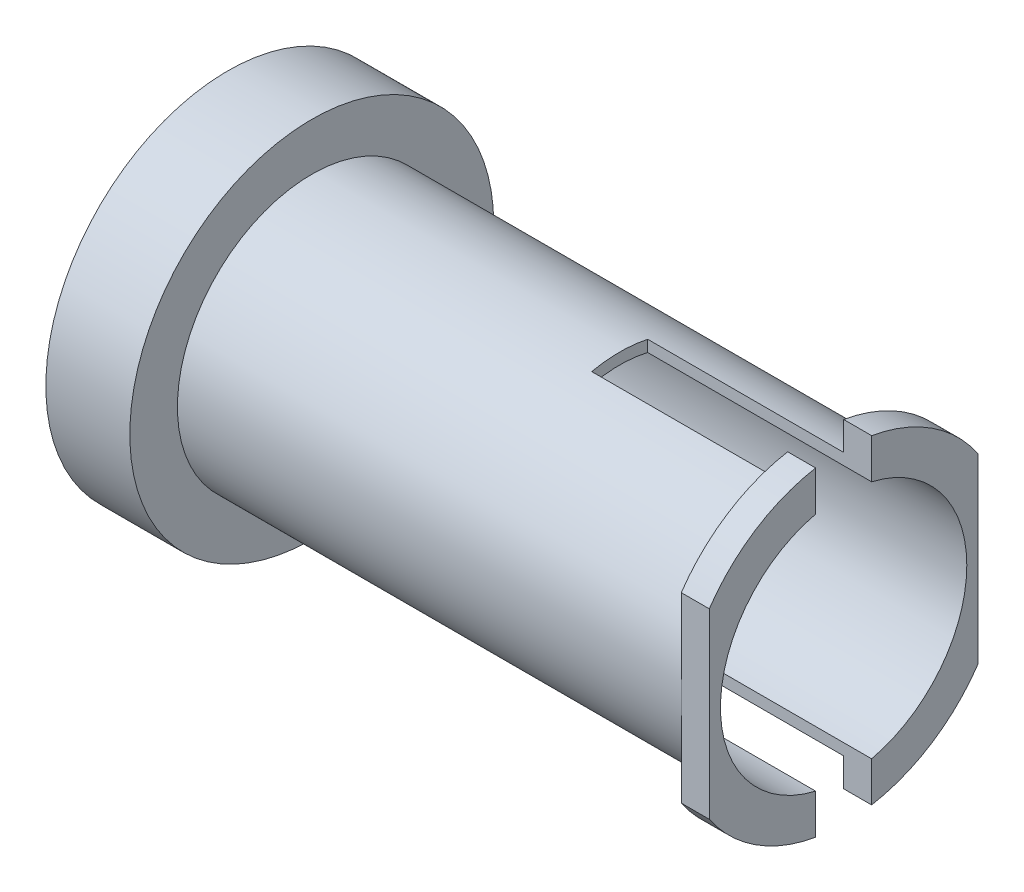
ISO-10303-21;
HEADER;
FILE_DESCRIPTION(('STEP AP214'),'2;1');
FILE_NAME('part.step','',(''),(''),'','','');
FILE_SCHEMA(('AUTOMOTIVE_DESIGN { 1 0 10303 214 1 1 1 1 }'));
ENDSEC;
DATA;
#1=APPLICATION_CONTEXT('core data for automotive mechanical design processes');
#2=APPLICATION_PROTOCOL_DEFINITION('international standard','automotive_design',2000,#1);
#3=PRODUCT_CONTEXT('',#1,'mechanical');
#4=PRODUCT('Part','Part','',(#3));
#5=PRODUCT_RELATED_PRODUCT_CATEGORY('part','',(#4));
#6=PRODUCT_DEFINITION_FORMATION('','',#4);
#7=PRODUCT_DEFINITION_CONTEXT('part definition',#1,'design');
#8=PRODUCT_DEFINITION('design','',#6,#7);
#9=PRODUCT_DEFINITION_SHAPE('','',#8);
#10=(LENGTH_UNIT() NAMED_UNIT(*) SI_UNIT(.MILLI.,.METRE.));
#11=(NAMED_UNIT(*) PLANE_ANGLE_UNIT() SI_UNIT($,.RADIAN.));
#12=(NAMED_UNIT(*) SI_UNIT($,.STERADIAN.) SOLID_ANGLE_UNIT());
#13=UNCERTAINTY_MEASURE_WITH_UNIT(LENGTH_MEASURE(1.E-05),#10,'distance_accuracy_value','');
#14=(GEOMETRIC_REPRESENTATION_CONTEXT(3) GLOBAL_UNCERTAINTY_ASSIGNED_CONTEXT((#13)) GLOBAL_UNIT_ASSIGNED_CONTEXT((#10,
#11,#12)) REPRESENTATION_CONTEXT('',''));
#15=CARTESIAN_POINT('',(0.,0.,0.));
#16=DIRECTION('',(0.,0.,1.));
#17=DIRECTION('',(1.,0.,0.));
#18=AXIS2_PLACEMENT_3D('',#15,#16,#17);
#19=CARTESIAN_POINT('',(7.,0.,0.));
#20=DIRECTION('',(1.,0.,0.));
#21=DIRECTION('',(0.,0.,-1.));
#22=AXIS2_PLACEMENT_3D('',#19,#20,#21);
#23=PLANE('',#22);
#24=CARTESIAN_POINT('',(7.,0.,0.));
#25=DIRECTION('',(1.,0.,0.));
#26=DIRECTION('',(0.,0.,-1.));
#27=AXIS2_PLACEMENT_3D('',#24,#25,#26);
#28=CIRCLE('',#27,2.2);
#29=CARTESIAN_POINT('',(7.,2.14242852856286,-0.5));
#30=VERTEX_POINT('',#29);
#31=CARTESIAN_POINT('',(7.,2.14242852856286,0.5));
#32=VERTEX_POINT('',#31);
#33=EDGE_CURVE('E152',#30,#32,#28,.T.);
#34=ORIENTED_EDGE('',*,*,#33,.F.);
#35=DIRECTION('',(0.,1.,0.));
#36=VECTOR('',#35,1.);
#37=CARTESIAN_POINT('',(7.,0.,-0.5));
#38=LINE('',#37,#36);
#39=CARTESIAN_POINT('',(7.,2.3473389188611,-0.5));
#40=VERTEX_POINT('',#39);
#41=EDGE_CURVE('E155',#30,#40,#38,.T.);
#42=ORIENTED_EDGE('',*,*,#41,.T.);
#43=CARTESIAN_POINT('',(7.,0.,0.));
#44=DIRECTION('',(1.,0.,0.));
#45=DIRECTION('',(0.,0.,-1.));
#46=AXIS2_PLACEMENT_3D('',#43,#44,#45);
#47=CIRCLE('',#46,2.4);
#48=CARTESIAN_POINT('',(7.,2.3473389188611,0.5));
#49=VERTEX_POINT('',#48);
#50=EDGE_CURVE('E265',#49,#40,#47,.F.);
#51=ORIENTED_EDGE('',*,*,#50,.F.);
#52=DIRECTION('',(0.,1.,0.));
#53=VECTOR('',#52,1.);
#54=CARTESIAN_POINT('',(7.,0.,0.5));
#55=LINE('',#54,#53);
#56=EDGE_CURVE('E158',#32,#49,#55,.T.);
#57=ORIENTED_EDGE('',*,*,#56,.F.);
#58=EDGE_LOOP('',(#34,#42,#51,#57));
#59=FACE_BOUND('',#58,.T.);
#60=ADVANCED_FACE('F33',(#59),#23,.T.);
#61=CARTESIAN_POINT('',(11.,0.,0.));
#62=DIRECTION('',(1.,0.,0.));
#63=DIRECTION('',(0.,0.,-1.));
#64=AXIS2_PLACEMENT_3D('',#61,#62,#63);
#65=CYLINDRICAL_SURFACE('',#64,2.4);
#66=DIRECTION('',(1.,0.,0.));
#67=VECTOR('',#66,1.);
#68=CARTESIAN_POINT('',(11.,-2.3473389188611,-0.5));
#69=LINE('',#68,#67);
#70=CARTESIAN_POINT('',(7.,-2.3473389188611,-0.5));
#71=VERTEX_POINT('',#70);
#72=CARTESIAN_POINT('',(10.5,-2.3473389188611,-0.5));
#73=VERTEX_POINT('',#72);
#74=EDGE_CURVE('E232',#71,#73,#69,.T.);
#75=ORIENTED_EDGE('',*,*,#74,.F.);
#76=CARTESIAN_POINT('',(7.,-2.3473389188611,0.5));
#77=VERTEX_POINT('',#76);
#78=EDGE_CURVE('E41',#71,#77,#47,.F.);
#79=ORIENTED_EDGE('',*,*,#78,.T.);
#80=DIRECTION('',(1.,0.,0.));
#81=VECTOR('',#80,1.);
#82=CARTESIAN_POINT('',(11.,-2.3473389188611,0.5));
#83=LINE('',#82,#81);
#84=CARTESIAN_POINT('',(10.5,-2.3473389188611,0.5));
#85=VERTEX_POINT('',#84);
#86=EDGE_CURVE('E227',#77,#85,#83,.T.);
#87=ORIENTED_EDGE('',*,*,#86,.T.);
#88=CARTESIAN_POINT('',(10.5,0.,0.));
#89=DIRECTION('',(1.,0.,0.));
#90=DIRECTION('',(0.,0.,-1.));
#91=AXIS2_PLACEMENT_3D('',#88,#89,#90);
#92=CIRCLE('',#91,2.4);
#93=CARTESIAN_POINT('',(10.5,0.,2.4));
#94=VERTEX_POINT('',#93);
#95=EDGE_CURVE('E298',#94,#85,#92,.T.);
#96=ORIENTED_EDGE('',*,*,#95,.F.);
#97=CARTESIAN_POINT('',(10.5,2.3473389188611,0.5));
#98=VERTEX_POINT('',#97);
#99=EDGE_CURVE('E257',#98,#94,#92,.T.);
#100=ORIENTED_EDGE('',*,*,#99,.F.);
#101=DIRECTION('',(1.,0.,0.));
#102=VECTOR('',#101,1.);
#103=CARTESIAN_POINT('',(11.,2.3473389188611,0.5));
#104=LINE('',#103,#102);
#105=EDGE_CURVE('E221',#98,#49,#104,.F.);
#106=ORIENTED_EDGE('',*,*,#105,.T.);
#107=ORIENTED_EDGE('',*,*,#50,.T.);
#108=DIRECTION('',(1.,0.,0.));
#109=VECTOR('',#108,1.);
#110=CARTESIAN_POINT('',(11.,2.3473389188611,-0.5));
#111=LINE('',#110,#109);
#112=CARTESIAN_POINT('',(10.5,2.3473389188611,-0.5));
#113=VERTEX_POINT('',#112);
#114=EDGE_CURVE('E177',#113,#40,#111,.F.);
#115=ORIENTED_EDGE('',*,*,#114,.F.);
#116=CARTESIAN_POINT('',(10.5,0.,-2.4));
#117=VERTEX_POINT('',#116);
#118=EDGE_CURVE('E253',#117,#113,#92,.T.);
#119=ORIENTED_EDGE('',*,*,#118,.F.);
#120=EDGE_CURVE('E251',#73,#117,#92,.T.);
#121=ORIENTED_EDGE('',*,*,#120,.F.);
#122=EDGE_LOOP('',(#75,#79,#87,#96,#100,#106,#107,#115,#119,#121));
#123=FACE_BOUND('',#122,.T.);
#124=CARTESIAN_POINT('',(1.5,0.,0.));
#125=DIRECTION('',(1.,0.,0.));
#126=DIRECTION('',(0.,0.,-1.));
#127=AXIS2_PLACEMENT_3D('',#124,#125,#126);
#128=CIRCLE('',#127,2.4);
#129=CARTESIAN_POINT('',(1.5,0.,-2.4));
#130=VERTEX_POINT('',#129);
#131=EDGE_CURVE('E256',#130,#130,#128,.T.);
#132=ORIENTED_EDGE('',*,*,#131,.T.);
#133=EDGE_LOOP('',(#132));
#134=FACE_BOUND('',#133,.T.);
#135=ADVANCED_FACE('F269',(#123,#134),#65,.T.);
#136=CARTESIAN_POINT('',(10.5,2.4,0.));
#137=DIRECTION('',(-1.,0.,0.));
#138=DIRECTION('',(0.,0.,1.));
#139=AXIS2_PLACEMENT_3D('',#136,#137,#138);
#140=PLANE('',#139);
#141=CARTESIAN_POINT('',(10.5,0.,0.));
#142=DIRECTION('',(1.,0.,0.));
#143=DIRECTION('',(0.,0.,-1.));
#144=AXIS2_PLACEMENT_3D('',#141,#142,#143);
#145=CIRCLE('',#144,2.9);
#146=CARTESIAN_POINT('',(10.5,-1.62788205960997,2.4));
#147=VERTEX_POINT('',#146);
#148=CARTESIAN_POINT('',(10.5,-2.85657137141714,0.5));
#149=VERTEX_POINT('',#148);
#150=EDGE_CURVE('E324',#147,#149,#145,.T.);
#151=ORIENTED_EDGE('',*,*,#150,.F.);
#152=DIRECTION('',(0.,1.,0.));
#153=VECTOR('',#152,1.);
#154=CARTESIAN_POINT('',(10.5,2.4,2.4));
#155=LINE('',#154,#153);
#156=EDGE_CURVE('E241',#147,#94,#155,.T.);
#157=ORIENTED_EDGE('',*,*,#156,.T.);
#158=ORIENTED_EDGE('',*,*,#95,.T.);
#159=DIRECTION('',(0.,-1.,0.));
#160=VECTOR('',#159,1.);
#161=CARTESIAN_POINT('',(10.5,2.4,0.5));
#162=LINE('',#161,#160);
#163=EDGE_CURVE('E224',#85,#149,#162,.T.);
#164=ORIENTED_EDGE('',*,*,#163,.T.);
#165=EDGE_LOOP('',(#151,#157,#158,#164));
#166=FACE_BOUND('',#165,.T.);
#167=ADVANCED_FACE('F347',(#166),#140,.T.);
#168=ORIENTED_EDGE('',*,*,#99,.T.);
#169=CARTESIAN_POINT('',(10.5,1.62788205960997,2.4));
#170=VERTEX_POINT('',#169);
#171=EDGE_CURVE('E238',#94,#170,#155,.T.);
#172=ORIENTED_EDGE('',*,*,#171,.T.);
#173=CARTESIAN_POINT('',(10.5,2.85657137141714,0.5));
#174=VERTEX_POINT('',#173);
#175=EDGE_CURVE('E252',#174,#170,#145,.T.);
#176=ORIENTED_EDGE('',*,*,#175,.F.);
#177=DIRECTION('',(0.,-1.,0.));
#178=VECTOR('',#177,1.);
#179=CARTESIAN_POINT('',(10.5,2.4,0.5));
#180=LINE('',#179,#178);
#181=EDGE_CURVE('E218',#174,#98,#180,.T.);
#182=ORIENTED_EDGE('',*,*,#181,.T.);
#183=EDGE_LOOP('',(#168,#172,#176,#182));
#184=FACE_BOUND('',#183,.T.);
#185=ADVANCED_FACE('F304',(#184),#140,.T.);
#186=CARTESIAN_POINT('',(10.5,1.62788205960997,-2.4));
#187=VERTEX_POINT('',#186);
#188=CARTESIAN_POINT('',(10.5,2.85657137141714,-0.5));
#189=VERTEX_POINT('',#188);
#190=EDGE_CURVE('E248',#187,#189,#145,.T.);
#191=ORIENTED_EDGE('',*,*,#190,.F.);
#192=DIRECTION('',(0.,-1.,0.));
#193=VECTOR('',#192,1.);
#194=CARTESIAN_POINT('',(10.5,2.4,-2.4));
#195=LINE('',#194,#193);
#196=EDGE_CURVE('E237',#187,#117,#195,.T.);
#197=ORIENTED_EDGE('',*,*,#196,.T.);
#198=ORIENTED_EDGE('',*,*,#118,.T.);
#199=DIRECTION('',(0.,-1.,0.));
#200=VECTOR('',#199,1.);
#201=CARTESIAN_POINT('',(10.5,2.4,-0.5));
#202=LINE('',#201,#200);
#203=EDGE_CURVE('E203',#189,#113,#202,.T.);
#204=ORIENTED_EDGE('',*,*,#203,.F.);
#205=EDGE_LOOP('',(#191,#197,#198,#204));
#206=FACE_BOUND('',#205,.T.);
#207=ADVANCED_FACE('F294',(#206),#140,.T.);
#208=ORIENTED_EDGE('',*,*,#120,.T.);
#209=CARTESIAN_POINT('',(10.5,-1.62788205960997,-2.4));
#210=VERTEX_POINT('',#209);
#211=EDGE_CURVE('E234',#117,#210,#195,.T.);
#212=ORIENTED_EDGE('',*,*,#211,.T.);
#213=CARTESIAN_POINT('',(10.5,-2.85657137141714,-0.5));
#214=VERTEX_POINT('',#213);
#215=EDGE_CURVE('E245',#214,#210,#145,.T.);
#216=ORIENTED_EDGE('',*,*,#215,.F.);
#217=DIRECTION('',(0.,-1.,0.));
#218=VECTOR('',#217,1.);
#219=CARTESIAN_POINT('',(10.5,2.4,-0.5));
#220=LINE('',#219,#218);
#221=EDGE_CURVE('E230',#73,#214,#220,.T.);
#222=ORIENTED_EDGE('',*,*,#221,.F.);
#223=EDGE_LOOP('',(#208,#212,#216,#222));
#224=FACE_BOUND('',#223,.T.);
#225=ADVANCED_FACE('F332',(#224),#140,.T.);
#226=CARTESIAN_POINT('',(11.,0.,0.));
#227=DIRECTION('',(1.,0.,0.));
#228=DIRECTION('',(0.,0.,-1.));
#229=AXIS2_PLACEMENT_3D('',#226,#227,#228);
#230=CYLINDRICAL_SURFACE('',#229,2.9);
#231=CARTESIAN_POINT('',(11.,0.,0.));
#232=DIRECTION('',(1.,0.,0.));
#233=DIRECTION('',(0.,0.,-1.));
#234=AXIS2_PLACEMENT_3D('',#231,#232,#233);
#235=CIRCLE('',#234,2.9);
#236=CARTESIAN_POINT('',(11.,-1.62788205960997,2.4));
#237=VERTEX_POINT('',#236);
#238=CARTESIAN_POINT('',(11.,-2.85657137141714,0.5));
#239=VERTEX_POINT('',#238);
#240=EDGE_CURVE('E317',#237,#239,#235,.T.);
#241=ORIENTED_EDGE('',*,*,#240,.F.);
#242=DIRECTION('',(1.,0.,0.));
#243=VECTOR('',#242,1.);
#244=CARTESIAN_POINT('',(7.,-1.62788205960997,2.4));
#245=LINE('',#244,#243);
#246=EDGE_CURVE('E56',#147,#237,#245,.T.);
#247=ORIENTED_EDGE('',*,*,#246,.F.);
#248=ORIENTED_EDGE('',*,*,#150,.T.);
#249=DIRECTION('',(1.,0.,0.));
#250=VECTOR('',#249,1.);
#251=CARTESIAN_POINT('',(7.,-2.85657137141714,0.5));
#252=LINE('',#251,#250);
#253=EDGE_CURVE('E204',#149,#239,#252,.T.);
#254=ORIENTED_EDGE('',*,*,#253,.T.);
#255=EDGE_LOOP('',(#241,#247,#248,#254));
#256=FACE_BOUND('',#255,.T.);
#257=ADVANCED_FACE('F322',(#256),#230,.T.);
#258=ORIENTED_EDGE('',*,*,#175,.T.);
#259=DIRECTION('',(1.,0.,0.));
#260=VECTOR('',#259,1.);
#261=CARTESIAN_POINT('',(7.,1.62788205960997,2.4));
#262=LINE('',#261,#260);
#263=CARTESIAN_POINT('',(11.,1.62788205960997,2.4));
#264=VERTEX_POINT('',#263);
#265=EDGE_CURVE('E342',#170,#264,#262,.T.);
#266=ORIENTED_EDGE('',*,*,#265,.T.);
#267=CARTESIAN_POINT('',(11.,2.85657137141714,0.5));
#268=VERTEX_POINT('',#267);
#269=EDGE_CURVE('E246',#268,#264,#235,.T.);
#270=ORIENTED_EDGE('',*,*,#269,.F.);
#271=DIRECTION('',(1.,0.,0.));
#272=VECTOR('',#271,1.);
#273=CARTESIAN_POINT('',(7.,2.85657137141714,0.5));
#274=LINE('',#273,#272);
#275=EDGE_CURVE('E211',#174,#268,#274,.T.);
#276=ORIENTED_EDGE('',*,*,#275,.F.);
#277=EDGE_LOOP('',(#258,#266,#270,#276));
#278=FACE_BOUND('',#277,.T.);
#279=ADVANCED_FACE('F346',(#278),#230,.T.);
#280=CARTESIAN_POINT('',(11.,1.62788205960997,-2.4));
#281=VERTEX_POINT('',#280);
#282=CARTESIAN_POINT('',(11.,2.85657137141714,-0.5));
#283=VERTEX_POINT('',#282);
#284=EDGE_CURVE('E242',#281,#283,#235,.T.);
#285=ORIENTED_EDGE('',*,*,#284,.F.);
#286=DIRECTION('',(1.,0.,0.));
#287=VECTOR('',#286,1.);
#288=CARTESIAN_POINT('',(7.,1.62788205960997,-2.4));
#289=LINE('',#288,#287);
#290=EDGE_CURVE('E190',#187,#281,#289,.T.);
#291=ORIENTED_EDGE('',*,*,#290,.F.);
#292=ORIENTED_EDGE('',*,*,#190,.T.);
#293=DIRECTION('',(1.,0.,0.));
#294=VECTOR('',#293,1.);
#295=CARTESIAN_POINT('',(7.,2.85657137141714,-0.5));
#296=LINE('',#295,#294);
#297=EDGE_CURVE('E172',#189,#283,#296,.T.);
#298=ORIENTED_EDGE('',*,*,#297,.T.);
#299=EDGE_LOOP('',(#285,#291,#292,#298));
#300=FACE_BOUND('',#299,.T.);
#301=ADVANCED_FACE('F289',(#300),#230,.T.);
#302=ORIENTED_EDGE('',*,*,#215,.T.);
#303=DIRECTION('',(1.,0.,0.));
#304=VECTOR('',#303,1.);
#305=CARTESIAN_POINT('',(7.,-1.62788205960997,-2.4));
#306=LINE('',#305,#304);
#307=CARTESIAN_POINT('',(11.,-1.62788205960997,-2.4));
#308=VERTEX_POINT('',#307);
#309=EDGE_CURVE('E331',#210,#308,#306,.T.);
#310=ORIENTED_EDGE('',*,*,#309,.T.);
#311=CARTESIAN_POINT('',(11.,-2.85657137141714,-0.5));
#312=VERTEX_POINT('',#311);
#313=EDGE_CURVE('E247',#312,#308,#235,.T.);
#314=ORIENTED_EDGE('',*,*,#313,.F.);
#315=DIRECTION('',(1.,0.,0.));
#316=VECTOR('',#315,1.);
#317=CARTESIAN_POINT('',(7.,-2.85657137141714,-0.5));
#318=LINE('',#317,#316);
#319=EDGE_CURVE('E201',#214,#312,#318,.T.);
#320=ORIENTED_EDGE('',*,*,#319,.F.);
#321=EDGE_LOOP('',(#302,#310,#314,#320));
#322=FACE_BOUND('',#321,.T.);
#323=ADVANCED_FACE('F330',(#322),#230,.T.);
#324=CARTESIAN_POINT('',(11.,2.9,0.));
#325=DIRECTION('',(1.,0.,0.));
#326=DIRECTION('',(0.,0.,-1.));
#327=AXIS2_PLACEMENT_3D('',#324,#325,#326);
#328=PLANE('',#327);
#329=ORIENTED_EDGE('',*,*,#269,.T.);
#330=DIRECTION('',(0.,-1.,0.));
#331=VECTOR('',#330,1.);
#332=CARTESIAN_POINT('',(11.,0.,2.4));
#333=LINE('',#332,#331);
#334=EDGE_CURVE('E340',#264,#237,#333,.T.);
#335=ORIENTED_EDGE('',*,*,#334,.T.);
#336=ORIENTED_EDGE('',*,*,#240,.T.);
#337=DIRECTION('',(0.,1.,0.));
#338=VECTOR('',#337,1.);
#339=CARTESIAN_POINT('',(11.,0.,0.5));
#340=LINE('',#339,#338);
#341=CARTESIAN_POINT('',(11.,-2.14242852856286,0.5));
#342=VERTEX_POINT('',#341);
#343=EDGE_CURVE('E183',#239,#342,#340,.T.);
#344=ORIENTED_EDGE('',*,*,#343,.T.);
#345=CARTESIAN_POINT('',(11.,0.,0.));
#346=DIRECTION('',(1.,0.,0.));
#347=DIRECTION('',(0.,0.,-1.));
#348=AXIS2_PLACEMENT_3D('',#345,#346,#347);
#349=CIRCLE('',#348,2.2);
#350=CARTESIAN_POINT('',(11.,2.14242852856286,0.5));
#351=VERTEX_POINT('',#350);
#352=EDGE_CURVE('E197',#351,#342,#349,.T.);
#353=ORIENTED_EDGE('',*,*,#352,.F.);
#354=DIRECTION('',(0.,1.,0.));
#355=VECTOR('',#354,1.);
#356=CARTESIAN_POINT('',(11.,0.,0.5));
#357=LINE('',#356,#355);
#358=EDGE_CURVE('E194',#351,#268,#357,.T.);
#359=ORIENTED_EDGE('',*,*,#358,.T.);
#360=EDGE_LOOP('',(#329,#335,#336,#344,#353,#359));
#361=FACE_BOUND('',#360,.T.);
#362=ADVANCED_FACE('F315',(#361),#328,.T.);
#363=ORIENTED_EDGE('',*,*,#313,.T.);
#364=DIRECTION('',(0.,1.,0.));
#365=VECTOR('',#364,1.);
#366=CARTESIAN_POINT('',(11.,0.,-2.4));
#367=LINE('',#366,#365);
#368=EDGE_CURVE('E335',#308,#281,#367,.T.);
#369=ORIENTED_EDGE('',*,*,#368,.T.);
#370=ORIENTED_EDGE('',*,*,#284,.T.);
#371=DIRECTION('',(0.,1.,0.));
#372=VECTOR('',#371,1.);
#373=CARTESIAN_POINT('',(11.,0.,-0.5));
#374=LINE('',#373,#372);
#375=CARTESIAN_POINT('',(11.,2.14242852856286,-0.5));
#376=VERTEX_POINT('',#375);
#377=EDGE_CURVE('E192',#376,#283,#374,.T.);
#378=ORIENTED_EDGE('',*,*,#377,.F.);
#379=CARTESIAN_POINT('',(11.,0.,0.));
#380=DIRECTION('',(1.,0.,0.));
#381=DIRECTION('',(0.,0.,-1.));
#382=AXIS2_PLACEMENT_3D('',#379,#380,#381);
#383=CIRCLE('',#382,2.2);
#384=CARTESIAN_POINT('',(11.,-2.14242852856286,-0.5));
#385=VERTEX_POINT('',#384);
#386=EDGE_CURVE('E169',#385,#376,#383,.T.);
#387=ORIENTED_EDGE('',*,*,#386,.F.);
#388=DIRECTION('',(0.,1.,0.));
#389=VECTOR('',#388,1.);
#390=CARTESIAN_POINT('',(11.,0.,-0.5));
#391=LINE('',#390,#389);
#392=EDGE_CURVE('E48',#312,#385,#391,.T.);
#393=ORIENTED_EDGE('',*,*,#392,.F.);
#394=EDGE_LOOP('',(#363,#369,#370,#378,#387,#393));
#395=FACE_BOUND('',#394,.T.);
#396=ADVANCED_FACE('F283',(#395),#328,.T.);
#397=CARTESIAN_POINT('',(0.,0.,0.));
#398=DIRECTION('',(-1.,0.,0.));
#399=DIRECTION('',(0.,0.,1.));
#400=AXIS2_PLACEMENT_3D('',#397,#398,#399);
#401=PLANE('',#400);
#402=CARTESIAN_POINT('',(0.,0.,0.));
#403=DIRECTION('',(1.,0.,0.));
#404=DIRECTION('',(0.,0.,-1.));
#405=AXIS2_PLACEMENT_3D('',#402,#403,#404);
#406=CIRCLE('',#405,3.25);
#407=CARTESIAN_POINT('',(0.,0.,-3.25));
#408=VERTEX_POINT('',#407);
#409=EDGE_CURVE('E263',#408,#408,#406,.T.);
#410=ORIENTED_EDGE('',*,*,#409,.F.);
#411=EDGE_LOOP('',(#410));
#412=FACE_BOUND('',#411,.T.);
#413=ADVANCED_FACE('F35',(#412),#401,.T.);
#414=CARTESIAN_POINT('',(11.,0.,0.));
#415=DIRECTION('',(1.,0.,0.));
#416=DIRECTION('',(0.,0.,-1.));
#417=AXIS2_PLACEMENT_3D('',#414,#415,#416);
#418=CYLINDRICAL_SURFACE('',#417,3.25);
#419=ORIENTED_EDGE('',*,*,#409,.T.);
#420=EDGE_LOOP('',(#419));
#421=FACE_BOUND('',#420,.T.);
#422=CARTESIAN_POINT('',(1.5,0.,0.));
#423=DIRECTION('',(1.,0.,0.));
#424=DIRECTION('',(0.,0.,-1.));
#425=AXIS2_PLACEMENT_3D('',#422,#423,#424);
#426=CIRCLE('',#425,3.25);
#427=CARTESIAN_POINT('',(1.5,0.,-3.25));
#428=VERTEX_POINT('',#427);
#429=EDGE_CURVE('E260',#428,#428,#426,.T.);
#430=ORIENTED_EDGE('',*,*,#429,.F.);
#431=EDGE_LOOP('',(#430));
#432=FACE_BOUND('',#431,.T.);
#433=ADVANCED_FACE('F387',(#421,#432),#418,.T.);
#434=CARTESIAN_POINT('',(1.5,3.25,0.));
#435=DIRECTION('',(1.,0.,0.));
#436=DIRECTION('',(0.,0.,-1.));
#437=AXIS2_PLACEMENT_3D('',#434,#435,#436);
#438=PLANE('',#437);
#439=ORIENTED_EDGE('',*,*,#429,.T.);
#440=EDGE_LOOP('',(#439));
#441=FACE_BOUND('',#440,.T.);
#442=ORIENTED_EDGE('',*,*,#131,.F.);
#443=EDGE_LOOP('',(#442));
#444=FACE_BOUND('',#443,.T.);
#445=ADVANCED_FACE('F379',(#441,#444),#438,.T.);
#446=CARTESIAN_POINT('',(7.,0.,-0.5));
#447=DIRECTION('',(0.,0.,-1.));
#448=DIRECTION('',(-1.,0.,0.));
#449=AXIS2_PLACEMENT_3D('',#446,#447,#448);
#450=PLANE('',#449);
#451=ORIENTED_EDGE('',*,*,#74,.T.);
#452=ORIENTED_EDGE('',*,*,#221,.T.);
#453=ORIENTED_EDGE('',*,*,#319,.T.);
#454=ORIENTED_EDGE('',*,*,#392,.T.);
#455=DIRECTION('',(1.,0.,0.));
#456=VECTOR('',#455,1.);
#457=CARTESIAN_POINT('',(7.,-2.14242852856286,-0.5));
#458=LINE('',#457,#456);
#459=CARTESIAN_POINT('',(7.,-2.14242852856286,-0.5));
#460=VERTEX_POINT('',#459);
#461=EDGE_CURVE('E173',#460,#385,#458,.T.);
#462=ORIENTED_EDGE('',*,*,#461,.F.);
#463=DIRECTION('',(0.,1.,0.));
#464=VECTOR('',#463,1.);
#465=CARTESIAN_POINT('',(7.,0.,-0.5));
#466=LINE('',#465,#464);
#467=EDGE_CURVE('E178',#71,#460,#466,.T.);
#468=ORIENTED_EDGE('',*,*,#467,.F.);
#469=EDGE_LOOP('',(#451,#452,#453,#454,#462,#468));
#470=FACE_BOUND('',#469,.T.);
#471=ADVANCED_FACE('F278',(#470),#450,.F.);
#472=CARTESIAN_POINT('',(7.,0.,0.5));
#473=DIRECTION('',(0.,0.,-1.));
#474=DIRECTION('',(-1.,0.,0.));
#475=AXIS2_PLACEMENT_3D('',#472,#473,#474);
#476=PLANE('',#475);
#477=DIRECTION('',(0.,1.,0.));
#478=VECTOR('',#477,1.);
#479=CARTESIAN_POINT('',(7.,0.,0.5));
#480=LINE('',#479,#478);
#481=CARTESIAN_POINT('',(7.,-2.14242852856286,0.5));
#482=VERTEX_POINT('',#481);
#483=EDGE_CURVE('E180',#77,#482,#480,.T.);
#484=ORIENTED_EDGE('',*,*,#483,.T.);
#485=DIRECTION('',(1.,0.,0.));
#486=VECTOR('',#485,1.);
#487=CARTESIAN_POINT('',(7.,-2.14242852856286,0.5));
#488=LINE('',#487,#486);
#489=EDGE_CURVE('E207',#482,#342,#488,.T.);
#490=ORIENTED_EDGE('',*,*,#489,.T.);
#491=ORIENTED_EDGE('',*,*,#343,.F.);
#492=ORIENTED_EDGE('',*,*,#253,.F.);
#493=ORIENTED_EDGE('',*,*,#163,.F.);
#494=ORIENTED_EDGE('',*,*,#86,.F.);
#495=EDGE_LOOP('',(#484,#490,#491,#492,#493,#494));
#496=FACE_BOUND('',#495,.T.);
#497=ADVANCED_FACE('F319',(#496),#476,.T.);
#498=CARTESIAN_POINT('',(7.,0.,0.));
#499=DIRECTION('',(1.,0.,0.));
#500=DIRECTION('',(0.,0.,-1.));
#501=AXIS2_PLACEMENT_3D('',#498,#499,#500);
#502=CYLINDRICAL_SURFACE('',#501,2.2);
#503=ORIENTED_EDGE('',*,*,#352,.T.);
#504=ORIENTED_EDGE('',*,*,#489,.F.);
#505=CARTESIAN_POINT('',(7.,0.,0.));
#506=DIRECTION('',(1.,0.,0.));
#507=DIRECTION('',(0.,0.,-1.));
#508=AXIS2_PLACEMENT_3D('',#505,#506,#507);
#509=CIRCLE('',#508,2.2);
#510=EDGE_CURVE('E11',#482,#460,#509,.T.);
#511=ORIENTED_EDGE('',*,*,#510,.T.);
#512=ORIENTED_EDGE('',*,*,#461,.T.);
#513=ORIENTED_EDGE('',*,*,#386,.T.);
#514=DIRECTION('',(1.,0.,0.));
#515=VECTOR('',#514,1.);
#516=CARTESIAN_POINT('',(7.,2.14242852856286,-0.5));
#517=LINE('',#516,#515);
#518=EDGE_CURVE('E164',#30,#376,#517,.T.);
#519=ORIENTED_EDGE('',*,*,#518,.F.);
#520=ORIENTED_EDGE('',*,*,#33,.T.);
#521=DIRECTION('',(1.,0.,0.));
#522=VECTOR('',#521,1.);
#523=CARTESIAN_POINT('',(7.,2.14242852856286,0.5));
#524=LINE('',#523,#522);
#525=EDGE_CURVE('E209',#32,#351,#524,.T.);
#526=ORIENTED_EDGE('',*,*,#525,.T.);
#527=EDGE_LOOP('',(#503,#504,#511,#512,#513,#519,#520,#526));
#528=FACE_BOUND('',#527,.T.);
#529=CARTESIAN_POINT('',(1.5,0.,0.));
#530=DIRECTION('',(1.,0.,0.));
#531=DIRECTION('',(0.,0.,-1.));
#532=AXIS2_PLACEMENT_3D('',#529,#530,#531);
#533=CIRCLE('',#532,2.2);
#534=CARTESIAN_POINT('',(1.5,0.,-2.2));
#535=VERTEX_POINT('',#534);
#536=EDGE_CURVE('E161',#535,#535,#533,.T.);
#537=ORIENTED_EDGE('',*,*,#536,.F.);
#538=EDGE_LOOP('',(#537));
#539=FACE_BOUND('',#538,.T.);
#540=ADVANCED_FACE('F166',(#528,#539),#502,.F.);
#541=CARTESIAN_POINT('',(7.,0.,0.5));
#542=DIRECTION('',(0.,0.,-1.));
#543=DIRECTION('',(-1.,0.,0.));
#544=AXIS2_PLACEMENT_3D('',#541,#542,#543);
#545=PLANE('',#544);
#546=ORIENTED_EDGE('',*,*,#181,.F.);
#547=ORIENTED_EDGE('',*,*,#275,.T.);
#548=ORIENTED_EDGE('',*,*,#358,.F.);
#549=ORIENTED_EDGE('',*,*,#525,.F.);
#550=ORIENTED_EDGE('',*,*,#56,.T.);
#551=ORIENTED_EDGE('',*,*,#105,.F.);
#552=EDGE_LOOP('',(#546,#547,#548,#549,#550,#551));
#553=FACE_BOUND('',#552,.T.);
#554=ADVANCED_FACE('F308',(#553),#545,.T.);
#555=CARTESIAN_POINT('',(7.,0.,-0.5));
#556=DIRECTION('',(0.,0.,-1.));
#557=DIRECTION('',(-1.,0.,0.));
#558=AXIS2_PLACEMENT_3D('',#555,#556,#557);
#559=PLANE('',#558);
#560=ORIENTED_EDGE('',*,*,#114,.T.);
#561=ORIENTED_EDGE('',*,*,#41,.F.);
#562=ORIENTED_EDGE('',*,*,#518,.T.);
#563=ORIENTED_EDGE('',*,*,#377,.T.);
#564=ORIENTED_EDGE('',*,*,#297,.F.);
#565=ORIENTED_EDGE('',*,*,#203,.T.);
#566=EDGE_LOOP('',(#560,#561,#562,#563,#564,#565));
#567=FACE_BOUND('',#566,.T.);
#568=ADVANCED_FACE('F175',(#567),#559,.F.);
#569=ORIENTED_EDGE('',*,*,#510,.F.);
#570=ORIENTED_EDGE('',*,*,#483,.F.);
#571=ORIENTED_EDGE('',*,*,#78,.F.);
#572=ORIENTED_EDGE('',*,*,#467,.T.);
#573=EDGE_LOOP('',(#569,#570,#571,#572));
#574=FACE_BOUND('',#573,.T.);
#575=ADVANCED_FACE('F277',(#574),#23,.T.);
#576=CARTESIAN_POINT('',(7.,0.,-2.4));
#577=DIRECTION('',(0.,0.,-1.));
#578=DIRECTION('',(-1.,0.,0.));
#579=AXIS2_PLACEMENT_3D('',#576,#577,#578);
#580=PLANE('',#579);
#581=ORIENTED_EDGE('',*,*,#290,.T.);
#582=ORIENTED_EDGE('',*,*,#368,.F.);
#583=ORIENTED_EDGE('',*,*,#309,.F.);
#584=ORIENTED_EDGE('',*,*,#211,.F.);
#585=ORIENTED_EDGE('',*,*,#196,.F.);
#586=EDGE_LOOP('',(#581,#582,#583,#584,#585));
#587=FACE_BOUND('',#586,.T.);
#588=ADVANCED_FACE('F334',(#587),#580,.T.);
#589=CARTESIAN_POINT('',(7.,0.,2.4));
#590=DIRECTION('',(0.,0.,1.));
#591=DIRECTION('',(0.,-1.,0.));
#592=AXIS2_PLACEMENT_3D('',#589,#590,#591);
#593=PLANE('',#592);
#594=ORIENTED_EDGE('',*,*,#246,.T.);
#595=ORIENTED_EDGE('',*,*,#334,.F.);
#596=ORIENTED_EDGE('',*,*,#265,.F.);
#597=ORIENTED_EDGE('',*,*,#171,.F.);
#598=ORIENTED_EDGE('',*,*,#156,.F.);
#599=EDGE_LOOP('',(#594,#595,#596,#597,#598));
#600=FACE_BOUND('',#599,.T.);
#601=ADVANCED_FACE('F348',(#600),#593,.T.);
#602=CARTESIAN_POINT('',(1.5,0.,0.));
#603=DIRECTION('',(1.,0.,0.));
#604=DIRECTION('',(0.,0.,-1.));
#605=AXIS2_PLACEMENT_3D('',#602,#603,#604);
#606=PLANE('',#605);
#607=ORIENTED_EDGE('',*,*,#536,.T.);
#608=EDGE_LOOP('',(#607));
#609=FACE_BOUND('',#608,.T.);
#610=ADVANCED_FACE('F350',(#609),#606,.T.);
#611=CLOSED_SHELL('',(#60,#135,#167,#185,#207,#225,#257,#279,#301,#323,#362,#396,#413,#433,#445,
#471,#497,#540,#554,#568,#575,#588,#601,#610));
#612=MANIFOLD_SOLID_BREP('B2',#611);
#613=ADVANCED_BREP_SHAPE_REPRESENTATION('',(#18,#612),#14);
#614=SHAPE_DEFINITION_REPRESENTATION(#9,#613);
ENDSEC;
END-ISO-10303-21;
